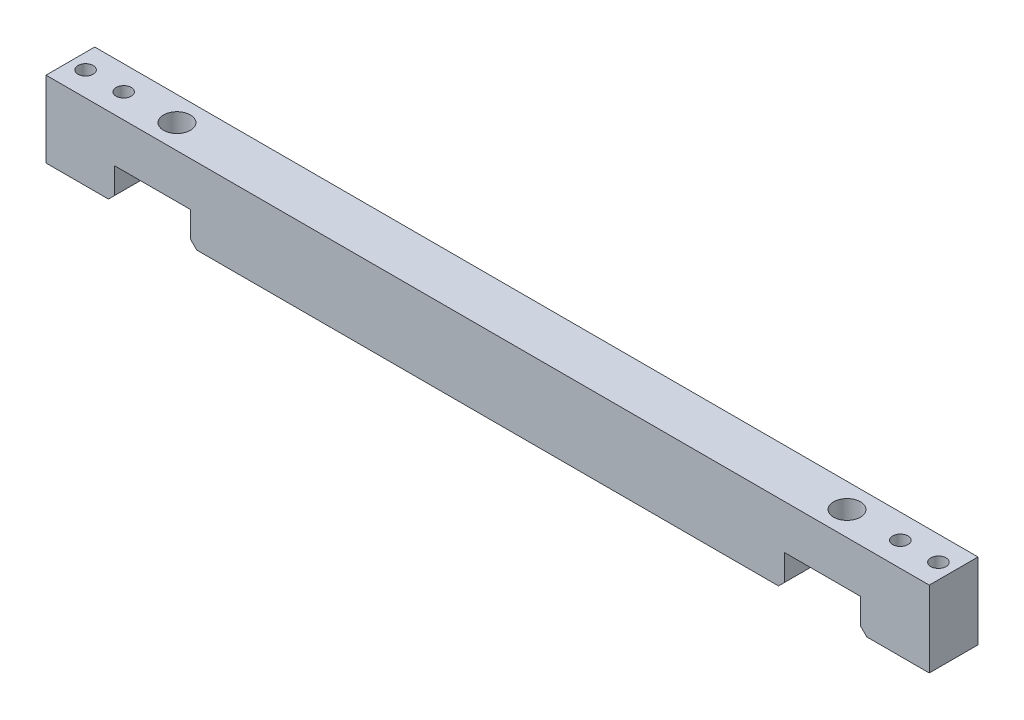
ISO-10303-21;
HEADER;
FILE_DESCRIPTION(('STEP AP214'),'2;1');
FILE_NAME('part.step','',(''),(''),'','','');
FILE_SCHEMA(('AUTOMOTIVE_DESIGN { 1 0 10303 214 1 1 1 1 }'));
ENDSEC;
DATA;
#1=APPLICATION_CONTEXT('core data for automotive mechanical design processes');
#2=APPLICATION_PROTOCOL_DEFINITION('international standard','automotive_design',2000,#1);
#3=PRODUCT_CONTEXT('',#1,'mechanical');
#4=PRODUCT('Part','Part','',(#3));
#5=PRODUCT_RELATED_PRODUCT_CATEGORY('part','',(#4));
#6=PRODUCT_DEFINITION_FORMATION('','',#4);
#7=PRODUCT_DEFINITION_CONTEXT('part definition',#1,'design');
#8=PRODUCT_DEFINITION('design','',#6,#7);
#9=PRODUCT_DEFINITION_SHAPE('','',#8);
#10=(LENGTH_UNIT() NAMED_UNIT(*) SI_UNIT(.MILLI.,.METRE.));
#11=(NAMED_UNIT(*) PLANE_ANGLE_UNIT() SI_UNIT($,.RADIAN.));
#12=(NAMED_UNIT(*) SI_UNIT($,.STERADIAN.) SOLID_ANGLE_UNIT());
#13=UNCERTAINTY_MEASURE_WITH_UNIT(LENGTH_MEASURE(1.E-05),#10,'distance_accuracy_value','');
#14=(GEOMETRIC_REPRESENTATION_CONTEXT(3) GLOBAL_UNCERTAINTY_ASSIGNED_CONTEXT((#13)) GLOBAL_UNIT_ASSIGNED_CONTEXT((#10,
#11,#12)) REPRESENTATION_CONTEXT('',''));
#15=CARTESIAN_POINT('',(0.,0.,0.));
#16=DIRECTION('',(0.,0.,1.));
#17=DIRECTION('',(1.,0.,0.));
#18=AXIS2_PLACEMENT_3D('',#15,#16,#17);
#19=CARTESIAN_POINT('',(0.,-12.5,0.));
#20=DIRECTION('',(0.,1.,0.));
#21=DIRECTION('',(0.,0.,1.));
#22=AXIS2_PLACEMENT_3D('',#19,#20,#21);
#23=PLANE('',#22);
#24=DIRECTION('',(1.,0.,0.));
#25=VECTOR('',#24,1.);
#26=CARTESIAN_POINT('',(-145.,-12.5,8.));
#27=LINE('',#26,#25);
#28=CARTESIAN_POINT('',(-95.5,-12.5,8.));
#29=VERTEX_POINT('',#28);
#30=CARTESIAN_POINT('',(95.5,-12.5,8.));
#31=VERTEX_POINT('',#30);
#32=EDGE_CURVE('E284',#29,#31,#27,.T.);
#33=ORIENTED_EDGE('',*,*,#32,.F.);
#34=DIRECTION('',(0.,0.,-1.));
#35=VECTOR('',#34,1.);
#36=CARTESIAN_POINT('',(-95.5,-12.5,-8.));
#37=LINE('',#36,#35);
#38=CARTESIAN_POINT('',(-95.5,-12.5,-8.));
#39=VERTEX_POINT('',#38);
#40=EDGE_CURVE('E11',#29,#39,#37,.T.);
#41=ORIENTED_EDGE('',*,*,#40,.T.);
#42=DIRECTION('',(-1.,0.,0.));
#43=VECTOR('',#42,1.);
#44=CARTESIAN_POINT('',(-145.,-12.5,-8.));
#45=LINE('',#44,#43);
#46=CARTESIAN_POINT('',(95.5,-12.5,-8.));
#47=VERTEX_POINT('',#46);
#48=EDGE_CURVE('E279',#47,#39,#45,.T.);
#49=ORIENTED_EDGE('',*,*,#48,.F.);
#50=DIRECTION('',(0.,0.,1.));
#51=VECTOR('',#50,1.);
#52=CARTESIAN_POINT('',(95.5,-12.5,0.));
#53=LINE('',#52,#51);
#54=EDGE_CURVE('E311',#47,#31,#53,.T.);
#55=ORIENTED_EDGE('',*,*,#54,.T.);
#56=EDGE_LOOP('',(#33,#41,#49,#55));
#57=FACE_BOUND('',#56,.T.);
#58=ADVANCED_FACE('F49',(#57),#23,.F.);
#59=CARTESIAN_POINT('',(-124.5,-12.5,-8.));
#60=VERTEX_POINT('',#59);
#61=CARTESIAN_POINT('',(-145.,-12.5,-8.));
#62=VERTEX_POINT('',#61);
#63=EDGE_CURVE('E274',#60,#62,#45,.T.);
#64=ORIENTED_EDGE('',*,*,#63,.F.);
#65=DIRECTION('',(0.,0.,1.));
#66=VECTOR('',#65,1.);
#67=CARTESIAN_POINT('',(-124.5,-12.5,8.));
#68=LINE('',#67,#66);
#69=CARTESIAN_POINT('',(-124.5,-12.5,8.));
#70=VERTEX_POINT('',#69);
#71=EDGE_CURVE('E328',#60,#70,#68,.T.);
#72=ORIENTED_EDGE('',*,*,#71,.T.);
#73=CARTESIAN_POINT('',(-145.,-12.5,8.));
#74=VERTEX_POINT('',#73);
#75=EDGE_CURVE('E264',#74,#70,#27,.T.);
#76=ORIENTED_EDGE('',*,*,#75,.F.);
#77=DIRECTION('',(0.,0.,1.));
#78=VECTOR('',#77,1.);
#79=CARTESIAN_POINT('',(-145.,-12.5,-8.));
#80=LINE('',#79,#78);
#81=EDGE_CURVE('E278',#62,#74,#80,.T.);
#82=ORIENTED_EDGE('',*,*,#81,.F.);
#83=EDGE_LOOP('',(#64,#72,#76,#82));
#84=FACE_BOUND('',#83,.T.);
#85=ADVANCED_FACE('F354',(#84),#23,.F.);
#86=CARTESIAN_POINT('',(-145.,12.5,-8.));
#87=DIRECTION('',(0.,0.,1.));
#88=DIRECTION('',(1.,0.,0.));
#89=AXIS2_PLACEMENT_3D('',#86,#87,#88);
#90=PLANE('',#89);
#91=DIRECTION('',(0.,1.,0.));
#92=VECTOR('',#91,1.);
#93=CARTESIAN_POINT('',(-122.5,-2.,-8.));
#94=LINE('',#93,#92);
#95=CARTESIAN_POINT('',(-122.5,-10.5,-8.));
#96=VERTEX_POINT('',#95);
#97=CARTESIAN_POINT('',(-122.5,-2.,-8.));
#98=VERTEX_POINT('',#97);
#99=EDGE_CURVE('E226',#96,#98,#94,.T.);
#100=ORIENTED_EDGE('',*,*,#99,.F.);
#101=DIRECTION('',(-0.707106781186543,-0.707106781186552,0.));
#102=VECTOR('',#101,1.);
#103=CARTESIAN_POINT('',(-122.5,-10.5,-8.));
#104=LINE('',#103,#102);
#105=EDGE_CURVE('E326',#96,#60,#104,.T.);
#106=ORIENTED_EDGE('',*,*,#105,.T.);
#107=ORIENTED_EDGE('',*,*,#63,.T.);
#108=DIRECTION('',(0.,-1.,0.));
#109=VECTOR('',#108,1.);
#110=CARTESIAN_POINT('',(-145.,12.5,-8.));
#111=LINE('',#110,#109);
#112=CARTESIAN_POINT('',(-145.,12.5,-8.));
#113=VERTEX_POINT('',#112);
#114=EDGE_CURVE('E290',#113,#62,#111,.T.);
#115=ORIENTED_EDGE('',*,*,#114,.F.);
#116=DIRECTION('',(-1.,0.,0.));
#117=VECTOR('',#116,1.);
#118=CARTESIAN_POINT('',(-145.,12.5,-8.));
#119=LINE('',#118,#117);
#120=CARTESIAN_POINT('',(145.,12.5,-8.));
#121=VERTEX_POINT('',#120);
#122=EDGE_CURVE('E263',#121,#113,#119,.T.);
#123=ORIENTED_EDGE('',*,*,#122,.F.);
#124=DIRECTION('',(0.,-1.,0.));
#125=VECTOR('',#124,1.);
#126=CARTESIAN_POINT('',(145.,12.5,-8.));
#127=LINE('',#126,#125);
#128=CARTESIAN_POINT('',(145.,-12.5,-8.));
#129=VERTEX_POINT('',#128);
#130=EDGE_CURVE('E293',#121,#129,#127,.T.);
#131=ORIENTED_EDGE('',*,*,#130,.T.);
#132=CARTESIAN_POINT('',(124.5,-12.5,-8.));
#133=VERTEX_POINT('',#132);
#134=EDGE_CURVE('E275',#129,#133,#45,.T.);
#135=ORIENTED_EDGE('',*,*,#134,.T.);
#136=DIRECTION('',(0.707106781186543,-0.707106781186552,0.));
#137=VECTOR('',#136,1.);
#138=CARTESIAN_POINT('',(124.5,-12.5,-8.));
#139=LINE('',#138,#137);
#140=CARTESIAN_POINT('',(122.5,-10.5,-8.));
#141=VERTEX_POINT('',#140);
#142=EDGE_CURVE('E303',#133,#141,#139,.F.);
#143=ORIENTED_EDGE('',*,*,#142,.T.);
#144=DIRECTION('',(0.,1.,0.));
#145=VECTOR('',#144,1.);
#146=CARTESIAN_POINT('',(122.5,-2.,-8.));
#147=LINE('',#146,#145);
#148=CARTESIAN_POINT('',(122.5,-2.,-8.));
#149=VERTEX_POINT('',#148);
#150=EDGE_CURVE('E241',#141,#149,#147,.T.);
#151=ORIENTED_EDGE('',*,*,#150,.T.);
#152=DIRECTION('',(-1.,0.,0.));
#153=VECTOR('',#152,1.);
#154=CARTESIAN_POINT('',(97.5,-2.,-8.));
#155=LINE('',#154,#153);
#156=CARTESIAN_POINT('',(97.5,-2.,-8.));
#157=VERTEX_POINT('',#156);
#158=EDGE_CURVE('E244',#149,#157,#155,.T.);
#159=ORIENTED_EDGE('',*,*,#158,.T.);
#160=DIRECTION('',(0.,-1.,0.));
#161=VECTOR('',#160,1.);
#162=CARTESIAN_POINT('',(97.5,-2.,-8.));
#163=LINE('',#162,#161);
#164=CARTESIAN_POINT('',(97.5,-10.4999999999999,-8.));
#165=VERTEX_POINT('',#164);
#166=EDGE_CURVE('E238',#157,#165,#163,.T.);
#167=ORIENTED_EDGE('',*,*,#166,.T.);
#168=DIRECTION('',(0.707106781186538,0.707106781186557,0.));
#169=VECTOR('',#168,1.);
#170=CARTESIAN_POINT('',(95.5,-12.5,-8.));
#171=LINE('',#170,#169);
#172=EDGE_CURVE('E301',#165,#47,#171,.F.);
#173=ORIENTED_EDGE('',*,*,#172,.T.);
#174=ORIENTED_EDGE('',*,*,#48,.T.);
#175=DIRECTION('',(-0.707106781186538,0.707106781186557,0.));
#176=VECTOR('',#175,1.);
#177=CARTESIAN_POINT('',(-97.5,-10.4999999999999,-8.));
#178=LINE('',#177,#176);
#179=CARTESIAN_POINT('',(-97.5,-10.4999999999999,-8.));
#180=VERTEX_POINT('',#179);
#181=EDGE_CURVE('E324',#39,#180,#178,.T.);
#182=ORIENTED_EDGE('',*,*,#181,.T.);
#183=DIRECTION('',(0.,-1.,0.));
#184=VECTOR('',#183,1.);
#185=CARTESIAN_POINT('',(-97.5,-2.,-8.));
#186=LINE('',#185,#184);
#187=CARTESIAN_POINT('',(-97.5,-2.,-8.));
#188=VERTEX_POINT('',#187);
#189=EDGE_CURVE('E220',#188,#180,#186,.T.);
#190=ORIENTED_EDGE('',*,*,#189,.F.);
#191=DIRECTION('',(1.,0.,0.));
#192=VECTOR('',#191,1.);
#193=CARTESIAN_POINT('',(-97.5,-2.,-8.));
#194=LINE('',#193,#192);
#195=EDGE_CURVE('E223',#98,#188,#194,.T.);
#196=ORIENTED_EDGE('',*,*,#195,.F.);
#197=EDGE_LOOP('',(#100,#106,#107,#115,#123,#131,#135,#143,#151,#159,#167,#173,#174,#182,#190,#196));
#198=FACE_BOUND('',#197,.T.);
#199=ADVANCED_FACE('F361',(#198),#90,.F.);
#200=CARTESIAN_POINT('',(-145.,12.5,8.));
#201=DIRECTION('',(0.,0.,-1.));
#202=DIRECTION('',(-1.,0.,0.));
#203=AXIS2_PLACEMENT_3D('',#200,#201,#202);
#204=PLANE('',#203);
#205=ORIENTED_EDGE('',*,*,#75,.T.);
#206=DIRECTION('',(0.707106781186543,0.707106781186552,0.));
#207=VECTOR('',#206,1.);
#208=CARTESIAN_POINT('',(-122.5,-10.5,8.));
#209=LINE('',#208,#207);
#210=CARTESIAN_POINT('',(-122.5,-10.5,8.));
#211=VERTEX_POINT('',#210);
#212=EDGE_CURVE('E331',#70,#211,#209,.T.);
#213=ORIENTED_EDGE('',*,*,#212,.T.);
#214=DIRECTION('',(0.,-1.,0.));
#215=VECTOR('',#214,1.);
#216=CARTESIAN_POINT('',(-122.5,12.5,8.));
#217=LINE('',#216,#215);
#218=CARTESIAN_POINT('',(-122.5,-2.,8.));
#219=VERTEX_POINT('',#218);
#220=EDGE_CURVE('E316',#219,#211,#217,.T.);
#221=ORIENTED_EDGE('',*,*,#220,.F.);
#222=DIRECTION('',(1.,0.,0.));
#223=VECTOR('',#222,1.);
#224=CARTESIAN_POINT('',(-97.5,-2.,8.));
#225=LINE('',#224,#223);
#226=CARTESIAN_POINT('',(-97.5,-2.,8.));
#227=VERTEX_POINT('',#226);
#228=EDGE_CURVE('E224',#219,#227,#225,.T.);
#229=ORIENTED_EDGE('',*,*,#228,.T.);
#230=DIRECTION('',(0.,-1.,0.));
#231=VECTOR('',#230,1.);
#232=CARTESIAN_POINT('',(-97.5,-2.,8.));
#233=LINE('',#232,#231);
#234=CARTESIAN_POINT('',(-97.5,-10.4999999999999,8.));
#235=VERTEX_POINT('',#234);
#236=EDGE_CURVE('E229',#227,#235,#233,.T.);
#237=ORIENTED_EDGE('',*,*,#236,.T.);
#238=DIRECTION('',(0.707106781186538,-0.707106781186557,0.));
#239=VECTOR('',#238,1.);
#240=CARTESIAN_POINT('',(-97.5,-10.4999999999999,8.));
#241=LINE('',#240,#239);
#242=EDGE_CURVE('E67',#235,#29,#241,.T.);
#243=ORIENTED_EDGE('',*,*,#242,.T.);
#244=ORIENTED_EDGE('',*,*,#32,.T.);
#245=DIRECTION('',(-0.707106781186538,-0.707106781186557,0.));
#246=VECTOR('',#245,1.);
#247=CARTESIAN_POINT('',(95.5,-12.5,8.));
#248=LINE('',#247,#246);
#249=CARTESIAN_POINT('',(97.5,-10.4999999999999,8.));
#250=VERTEX_POINT('',#249);
#251=EDGE_CURVE('E307',#31,#250,#248,.F.);
#252=ORIENTED_EDGE('',*,*,#251,.T.);
#253=DIRECTION('',(0.,-1.,0.));
#254=VECTOR('',#253,1.);
#255=CARTESIAN_POINT('',(97.5,-2.,8.));
#256=LINE('',#255,#254);
#257=CARTESIAN_POINT('',(97.5,-2.,8.));
#258=VERTEX_POINT('',#257);
#259=EDGE_CURVE('E248',#258,#250,#256,.T.);
#260=ORIENTED_EDGE('',*,*,#259,.F.);
#261=DIRECTION('',(-1.,0.,0.));
#262=VECTOR('',#261,1.);
#263=CARTESIAN_POINT('',(97.5,-2.,8.));
#264=LINE('',#263,#262);
#265=CARTESIAN_POINT('',(122.5,-2.,8.));
#266=VERTEX_POINT('',#265);
#267=EDGE_CURVE('E242',#266,#258,#264,.T.);
#268=ORIENTED_EDGE('',*,*,#267,.F.);
#269=DIRECTION('',(0.,1.,0.));
#270=VECTOR('',#269,1.);
#271=CARTESIAN_POINT('',(122.5,-2.,8.));
#272=LINE('',#271,#270);
#273=CARTESIAN_POINT('',(122.5,-10.5,8.));
#274=VERTEX_POINT('',#273);
#275=EDGE_CURVE('E251',#274,#266,#272,.T.);
#276=ORIENTED_EDGE('',*,*,#275,.F.);
#277=DIRECTION('',(-0.707106781186543,0.707106781186552,0.));
#278=VECTOR('',#277,1.);
#279=CARTESIAN_POINT('',(124.5,-12.5,8.));
#280=LINE('',#279,#278);
#281=CARTESIAN_POINT('',(124.5,-12.5,8.));
#282=VERTEX_POINT('',#281);
#283=EDGE_CURVE('E309',#274,#282,#280,.F.);
#284=ORIENTED_EDGE('',*,*,#283,.T.);
#285=CARTESIAN_POINT('',(145.,-12.5,8.));
#286=VERTEX_POINT('',#285);
#287=EDGE_CURVE('E281',#282,#286,#27,.T.);
#288=ORIENTED_EDGE('',*,*,#287,.T.);
#289=DIRECTION('',(0.,-1.,0.));
#290=VECTOR('',#289,1.);
#291=CARTESIAN_POINT('',(145.,12.5,8.));
#292=LINE('',#291,#290);
#293=CARTESIAN_POINT('',(145.,12.5,8.));
#294=VERTEX_POINT('',#293);
#295=EDGE_CURVE('E270',#294,#286,#292,.T.);
#296=ORIENTED_EDGE('',*,*,#295,.F.);
#297=DIRECTION('',(1.,0.,0.));
#298=VECTOR('',#297,1.);
#299=CARTESIAN_POINT('',(-145.,12.5,8.));
#300=LINE('',#299,#298);
#301=CARTESIAN_POINT('',(-145.,12.5,8.));
#302=VERTEX_POINT('',#301);
#303=EDGE_CURVE('E268',#302,#294,#300,.T.);
#304=ORIENTED_EDGE('',*,*,#303,.F.);
#305=DIRECTION('',(0.,-1.,0.));
#306=VECTOR('',#305,1.);
#307=CARTESIAN_POINT('',(-145.,12.5,8.));
#308=LINE('',#307,#306);
#309=EDGE_CURVE('E287',#302,#74,#308,.T.);
#310=ORIENTED_EDGE('',*,*,#309,.T.);
#311=EDGE_LOOP('',(#205,#213,#221,#229,#237,#243,#244,#252,#260,#268,#276,#284,#288,#296,#304,#310));
#312=FACE_BOUND('',#311,.T.);
#313=ADVANCED_FACE('F416',(#312),#204,.F.);
#314=CARTESIAN_POINT('',(-110.,12.5,0.));
#315=DIRECTION('',(0.,1.,0.));
#316=DIRECTION('',(0.,0.,1.));
#317=AXIS2_PLACEMENT_3D('',#314,#315,#316);
#318=CYLINDRICAL_SURFACE('',#317,2.1);
#319=CARTESIAN_POINT('',(-110.,2.11802057623661,0.));
#320=DIRECTION('',(0.,1.,0.));
#321=DIRECTION('',(0.,0.,1.));
#322=AXIS2_PLACEMENT_3D('',#319,#320,#321);
#323=CIRCLE('',#322,2.1);
#324=CARTESIAN_POINT('',(-110.,2.11802057623661,2.1));
#325=VERTEX_POINT('',#324);
#326=EDGE_CURVE('E54',#325,#325,#323,.T.);
#327=ORIENTED_EDGE('',*,*,#326,.T.);
#328=EDGE_LOOP('',(#327));
#329=FACE_BOUND('',#328,.T.);
#330=CARTESIAN_POINT('',(-110.,-2.,0.));
#331=DIRECTION('',(0.,-1.,0.));
#332=DIRECTION('',(1.,0.,0.));
#333=AXIS2_PLACEMENT_3D('',#330,#331,#332);
#334=CIRCLE('',#333,2.1);
#335=CARTESIAN_POINT('',(-107.9,-2.,0.));
#336=VERTEX_POINT('',#335);
#337=EDGE_CURVE('E235',#336,#336,#334,.F.);
#338=ORIENTED_EDGE('',*,*,#337,.F.);
#339=EDGE_LOOP('',(#338));
#340=FACE_BOUND('',#339,.T.);
#341=ADVANCED_FACE('F448',(#329,#340),#318,.F.);
#342=CARTESIAN_POINT('',(145.,12.5,-8.));
#343=DIRECTION('',(-1.,0.,0.));
#344=DIRECTION('',(0.,0.,1.));
#345=AXIS2_PLACEMENT_3D('',#342,#343,#344);
#346=PLANE('',#345);
#347=DIRECTION('',(0.,0.,-1.));
#348=VECTOR('',#347,1.);
#349=CARTESIAN_POINT('',(145.,-12.5,-8.));
#350=LINE('',#349,#348);
#351=EDGE_CURVE('E271',#286,#129,#350,.T.);
#352=ORIENTED_EDGE('',*,*,#351,.T.);
#353=ORIENTED_EDGE('',*,*,#130,.F.);
#354=DIRECTION('',(0.,0.,-1.));
#355=VECTOR('',#354,1.);
#356=CARTESIAN_POINT('',(145.,12.5,-8.));
#357=LINE('',#356,#355);
#358=EDGE_CURVE('E260',#294,#121,#357,.T.);
#359=ORIENTED_EDGE('',*,*,#358,.F.);
#360=ORIENTED_EDGE('',*,*,#295,.T.);
#361=EDGE_LOOP('',(#352,#353,#359,#360));
#362=FACE_BOUND('',#361,.T.);
#363=ADVANCED_FACE('F450',(#362),#346,.F.);
#364=CARTESIAN_POINT('',(-145.,12.5,-8.));
#365=DIRECTION('',(1.,0.,0.));
#366=DIRECTION('',(0.,0.,-1.));
#367=AXIS2_PLACEMENT_3D('',#364,#365,#366);
#368=PLANE('',#367);
#369=ORIENTED_EDGE('',*,*,#81,.T.);
#370=ORIENTED_EDGE('',*,*,#309,.F.);
#371=DIRECTION('',(0.,0.,1.));
#372=VECTOR('',#371,1.);
#373=CARTESIAN_POINT('',(-145.,12.5,-8.));
#374=LINE('',#373,#372);
#375=EDGE_CURVE('E266',#113,#302,#374,.T.);
#376=ORIENTED_EDGE('',*,*,#375,.F.);
#377=ORIENTED_EDGE('',*,*,#114,.T.);
#378=EDGE_LOOP('',(#369,#370,#376,#377));
#379=FACE_BOUND('',#378,.T.);
#380=ADVANCED_FACE('F374',(#379),#368,.F.);
#381=CARTESIAN_POINT('',(0.,12.5,0.));
#382=DIRECTION('',(0.,1.,0.));
#383=DIRECTION('',(0.,0.,1.));
#384=AXIS2_PLACEMENT_3D('',#381,#382,#383);
#385=PLANE('',#384);
#386=CARTESIAN_POINT('',(-140.,12.5,0.));
#387=DIRECTION('',(0.,1.,0.));
#388=DIRECTION('',(0.,0.,1.));
#389=AXIS2_PLACEMENT_3D('',#386,#387,#388);
#390=CIRCLE('',#389,2.5);
#391=CARTESIAN_POINT('',(-140.,12.5,2.5));
#392=VERTEX_POINT('',#391);
#393=EDGE_CURVE('E185',#392,#392,#390,.T.);
#394=ORIENTED_EDGE('',*,*,#393,.F.);
#395=EDGE_LOOP('',(#394));
#396=FACE_BOUND('',#395,.T.);
#397=CARTESIAN_POINT('',(-127.5,12.5,0.));
#398=DIRECTION('',(0.,1.,0.));
#399=DIRECTION('',(0.,0.,1.));
#400=AXIS2_PLACEMENT_3D('',#397,#398,#399);
#401=CIRCLE('',#400,2.5);
#402=CARTESIAN_POINT('',(-127.5,12.5,2.5));
#403=VERTEX_POINT('',#402);
#404=EDGE_CURVE('E184',#403,#403,#401,.T.);
#405=ORIENTED_EDGE('',*,*,#404,.F.);
#406=EDGE_LOOP('',(#405));
#407=FACE_BOUND('',#406,.T.);
#408=CARTESIAN_POINT('',(127.5,12.5,0.));
#409=DIRECTION('',(0.,1.,0.));
#410=DIRECTION('',(0.,0.,1.));
#411=AXIS2_PLACEMENT_3D('',#408,#409,#410);
#412=CIRCLE('',#411,2.5);
#413=CARTESIAN_POINT('',(127.5,12.5,2.5));
#414=VERTEX_POINT('',#413);
#415=EDGE_CURVE('E195',#414,#414,#412,.T.);
#416=ORIENTED_EDGE('',*,*,#415,.F.);
#417=EDGE_LOOP('',(#416));
#418=FACE_BOUND('',#417,.T.);
#419=CARTESIAN_POINT('',(140.,12.5,0.));
#420=DIRECTION('',(0.,1.,0.));
#421=DIRECTION('',(0.,0.,1.));
#422=AXIS2_PLACEMENT_3D('',#419,#420,#421);
#423=CIRCLE('',#422,2.5);
#424=CARTESIAN_POINT('',(140.,12.5,2.5));
#425=VERTEX_POINT('',#424);
#426=EDGE_CURVE('E201',#425,#425,#423,.T.);
#427=ORIENTED_EDGE('',*,*,#426,.F.);
#428=EDGE_LOOP('',(#427));
#429=FACE_BOUND('',#428,.T.);
#430=CARTESIAN_POINT('',(-110.,12.5,0.));
#431=DIRECTION('',(0.,1.,0.));
#432=DIRECTION('',(0.,0.,1.));
#433=AXIS2_PLACEMENT_3D('',#430,#431,#432);
#434=CIRCLE('',#433,4.39999999999999);
#435=CARTESIAN_POINT('',(-110.,12.5,4.39999999999999));
#436=VERTEX_POINT('',#435);
#437=EDGE_CURVE('E207',#436,#436,#434,.T.);
#438=ORIENTED_EDGE('',*,*,#437,.F.);
#439=EDGE_LOOP('',(#438));
#440=FACE_BOUND('',#439,.T.);
#441=CARTESIAN_POINT('',(110.,12.5,0.));
#442=DIRECTION('',(0.,1.,0.));
#443=DIRECTION('',(0.,0.,1.));
#444=AXIS2_PLACEMENT_3D('',#441,#442,#443);
#445=CIRCLE('',#444,4.39999999999999);
#446=CARTESIAN_POINT('',(110.,12.5,4.39999999999999));
#447=VERTEX_POINT('',#446);
#448=EDGE_CURVE('E213',#447,#447,#445,.T.);
#449=ORIENTED_EDGE('',*,*,#448,.F.);
#450=EDGE_LOOP('',(#449));
#451=FACE_BOUND('',#450,.T.);
#452=ORIENTED_EDGE('',*,*,#358,.T.);
#453=ORIENTED_EDGE('',*,*,#122,.T.);
#454=ORIENTED_EDGE('',*,*,#375,.T.);
#455=ORIENTED_EDGE('',*,*,#303,.T.);
#456=EDGE_LOOP('',(#452,#453,#454,#455));
#457=FACE_BOUND('',#456,.T.);
#458=ADVANCED_FACE('F366',(#396,#407,#418,#429,#440,#451,#457),#385,.T.);
#459=ORIENTED_EDGE('',*,*,#287,.F.);
#460=DIRECTION('',(0.,0.,-1.));
#461=VECTOR('',#460,1.);
#462=CARTESIAN_POINT('',(124.5,-12.5,0.));
#463=LINE('',#462,#461);
#464=EDGE_CURVE('E296',#282,#133,#463,.T.);
#465=ORIENTED_EDGE('',*,*,#464,.T.);
#466=ORIENTED_EDGE('',*,*,#134,.F.);
#467=ORIENTED_EDGE('',*,*,#351,.F.);
#468=EDGE_LOOP('',(#459,#465,#466,#467));
#469=FACE_BOUND('',#468,.T.);
#470=ADVANCED_FACE('F357',(#469),#23,.F.);
#471=CARTESIAN_POINT('',(110.,12.5,0.));
#472=DIRECTION('',(0.,1.,0.));
#473=DIRECTION('',(0.,0.,1.));
#474=AXIS2_PLACEMENT_3D('',#471,#472,#473);
#475=CYLINDRICAL_SURFACE('',#474,2.1);
#476=CARTESIAN_POINT('',(110.,2.11802057623661,0.));
#477=DIRECTION('',(0.,1.,0.));
#478=DIRECTION('',(0.,0.,1.));
#479=AXIS2_PLACEMENT_3D('',#476,#477,#478);
#480=CIRCLE('',#479,2.1);
#481=CARTESIAN_POINT('',(110.,2.11802057623661,2.1));
#482=VERTEX_POINT('',#481);
#483=EDGE_CURVE('E219',#482,#482,#480,.T.);
#484=ORIENTED_EDGE('',*,*,#483,.T.);
#485=EDGE_LOOP('',(#484));
#486=FACE_BOUND('',#485,.T.);
#487=CARTESIAN_POINT('',(110.,-2.,0.));
#488=DIRECTION('',(0.,1.,0.));
#489=DIRECTION('',(-1.,0.,0.));
#490=AXIS2_PLACEMENT_3D('',#487,#488,#489);
#491=CIRCLE('',#490,2.1);
#492=CARTESIAN_POINT('',(107.9,-2.,0.));
#493=VERTEX_POINT('',#492);
#494=EDGE_CURVE('E257',#493,#493,#491,.F.);
#495=ORIENTED_EDGE('',*,*,#494,.T.);
#496=EDGE_LOOP('',(#495));
#497=FACE_BOUND('',#496,.T.);
#498=ADVANCED_FACE('F336',(#486,#497),#475,.F.);
#499=CARTESIAN_POINT('',(97.5,-2.,-8.));
#500=DIRECTION('',(-1.,0.,0.));
#501=DIRECTION('',(0.,0.,1.));
#502=AXIS2_PLACEMENT_3D('',#499,#500,#501);
#503=PLANE('',#502);
#504=ORIENTED_EDGE('',*,*,#259,.T.);
#505=DIRECTION('',(0.,0.,-1.));
#506=VECTOR('',#505,1.);
#507=CARTESIAN_POINT('',(97.5,-10.4999999999999,-8.));
#508=LINE('',#507,#506);
#509=EDGE_CURVE('E314',#250,#165,#508,.T.);
#510=ORIENTED_EDGE('',*,*,#509,.T.);
#511=ORIENTED_EDGE('',*,*,#166,.F.);
#512=DIRECTION('',(0.,0.,1.));
#513=VECTOR('',#512,1.);
#514=CARTESIAN_POINT('',(97.5,-2.,-8.));
#515=LINE('',#514,#513);
#516=EDGE_CURVE('E255',#157,#258,#515,.T.);
#517=ORIENTED_EDGE('',*,*,#516,.T.);
#518=EDGE_LOOP('',(#504,#510,#511,#517));
#519=FACE_BOUND('',#518,.T.);
#520=ADVANCED_FACE('F372',(#519),#503,.F.);
#521=CARTESIAN_POINT('',(122.5,-2.,-8.));
#522=DIRECTION('',(1.,0.,0.));
#523=DIRECTION('',(0.,0.,-1.));
#524=AXIS2_PLACEMENT_3D('',#521,#522,#523);
#525=PLANE('',#524);
#526=ORIENTED_EDGE('',*,*,#150,.F.);
#527=DIRECTION('',(0.,0.,1.));
#528=VECTOR('',#527,1.);
#529=CARTESIAN_POINT('',(122.5,-10.5,-8.));
#530=LINE('',#529,#528);
#531=EDGE_CURVE('E305',#141,#274,#530,.T.);
#532=ORIENTED_EDGE('',*,*,#531,.T.);
#533=ORIENTED_EDGE('',*,*,#275,.T.);
#534=DIRECTION('',(0.,0.,1.));
#535=VECTOR('',#534,1.);
#536=CARTESIAN_POINT('',(122.5,-2.,-8.));
#537=LINE('',#536,#535);
#538=EDGE_CURVE('E247',#149,#266,#537,.T.);
#539=ORIENTED_EDGE('',*,*,#538,.F.);
#540=EDGE_LOOP('',(#526,#532,#533,#539));
#541=FACE_BOUND('',#540,.T.);
#542=ADVANCED_FACE('F389',(#541),#525,.F.);
#543=CARTESIAN_POINT('',(97.5,-2.,-8.));
#544=DIRECTION('',(0.,1.,0.));
#545=DIRECTION('',(-1.,0.,0.));
#546=AXIS2_PLACEMENT_3D('',#543,#544,#545);
#547=PLANE('',#546);
#548=ORIENTED_EDGE('',*,*,#267,.T.);
#549=ORIENTED_EDGE('',*,*,#516,.F.);
#550=ORIENTED_EDGE('',*,*,#158,.F.);
#551=ORIENTED_EDGE('',*,*,#538,.T.);
#552=EDGE_LOOP('',(#548,#549,#550,#551));
#553=FACE_BOUND('',#552,.T.);
#554=ORIENTED_EDGE('',*,*,#494,.F.);
#555=EDGE_LOOP('',(#554));
#556=FACE_BOUND('',#555,.T.);
#557=ADVANCED_FACE('F394',(#553,#556),#547,.F.);
#558=CARTESIAN_POINT('',(124.5,-12.5,0.));
#559=DIRECTION('',(0.707106781186552,0.707106781186543,0.));
#560=DIRECTION('',(0.,0.,-1.));
#561=AXIS2_PLACEMENT_3D('',#558,#559,#560);
#562=PLANE('',#561);
#563=ORIENTED_EDGE('',*,*,#283,.F.);
#564=ORIENTED_EDGE('',*,*,#531,.F.);
#565=ORIENTED_EDGE('',*,*,#142,.F.);
#566=ORIENTED_EDGE('',*,*,#464,.F.);
#567=EDGE_LOOP('',(#563,#564,#565,#566));
#568=FACE_BOUND('',#567,.T.);
#569=ADVANCED_FACE('F382',(#568),#562,.F.);
#570=CARTESIAN_POINT('',(95.5,-12.5,0.));
#571=DIRECTION('',(-0.707106781186557,0.707106781186538,0.));
#572=DIRECTION('',(0.,0.,1.));
#573=AXIS2_PLACEMENT_3D('',#570,#571,#572);
#574=PLANE('',#573);
#575=ORIENTED_EDGE('',*,*,#172,.F.);
#576=ORIENTED_EDGE('',*,*,#509,.F.);
#577=ORIENTED_EDGE('',*,*,#251,.F.);
#578=ORIENTED_EDGE('',*,*,#54,.F.);
#579=EDGE_LOOP('',(#575,#576,#577,#578));
#580=FACE_BOUND('',#579,.T.);
#581=ADVANCED_FACE('F404',(#580),#574,.F.);
#582=CARTESIAN_POINT('',(-97.5,-2.,-8.));
#583=DIRECTION('',(-1.,0.,0.));
#584=DIRECTION('',(0.,0.,1.));
#585=AXIS2_PLACEMENT_3D('',#582,#583,#584);
#586=PLANE('',#585);
#587=ORIENTED_EDGE('',*,*,#189,.T.);
#588=DIRECTION('',(0.,0.,1.));
#589=VECTOR('',#588,1.);
#590=CARTESIAN_POINT('',(-97.5,-10.4999999999999,8.));
#591=LINE('',#590,#589);
#592=EDGE_CURVE('E59',#180,#235,#591,.T.);
#593=ORIENTED_EDGE('',*,*,#592,.T.);
#594=ORIENTED_EDGE('',*,*,#236,.F.);
#595=DIRECTION('',(0.,0.,1.));
#596=VECTOR('',#595,1.);
#597=CARTESIAN_POINT('',(-97.5,-2.,-8.));
#598=LINE('',#597,#596);
#599=EDGE_CURVE('E228',#188,#227,#598,.T.);
#600=ORIENTED_EDGE('',*,*,#599,.F.);
#601=EDGE_LOOP('',(#587,#593,#594,#600));
#602=FACE_BOUND('',#601,.T.);
#603=ADVANCED_FACE('F432',(#602),#586,.T.);
#604=CARTESIAN_POINT('',(-122.5,-2.,-8.));
#605=DIRECTION('',(1.,0.,0.));
#606=DIRECTION('',(0.,0.,-1.));
#607=AXIS2_PLACEMENT_3D('',#604,#605,#606);
#608=PLANE('',#607);
#609=ORIENTED_EDGE('',*,*,#220,.T.);
#610=DIRECTION('',(0.,0.,-1.));
#611=VECTOR('',#610,1.);
#612=CARTESIAN_POINT('',(-122.5,-10.5,-8.));
#613=LINE('',#612,#611);
#614=EDGE_CURVE('E321',#211,#96,#613,.T.);
#615=ORIENTED_EDGE('',*,*,#614,.T.);
#616=ORIENTED_EDGE('',*,*,#99,.T.);
#617=DIRECTION('',(0.,0.,1.));
#618=VECTOR('',#617,1.);
#619=CARTESIAN_POINT('',(-122.5,-2.,-8.));
#620=LINE('',#619,#618);
#621=EDGE_CURVE('E233',#98,#219,#620,.T.);
#622=ORIENTED_EDGE('',*,*,#621,.T.);
#623=EDGE_LOOP('',(#609,#615,#616,#622));
#624=FACE_BOUND('',#623,.T.);
#625=ADVANCED_FACE('F422',(#624),#608,.T.);
#626=CARTESIAN_POINT('',(-97.5,-2.,-8.));
#627=DIRECTION('',(0.,-1.,0.));
#628=DIRECTION('',(1.,0.,0.));
#629=AXIS2_PLACEMENT_3D('',#626,#627,#628);
#630=PLANE('',#629);
#631=ORIENTED_EDGE('',*,*,#228,.F.);
#632=ORIENTED_EDGE('',*,*,#621,.F.);
#633=ORIENTED_EDGE('',*,*,#195,.T.);
#634=ORIENTED_EDGE('',*,*,#599,.T.);
#635=EDGE_LOOP('',(#631,#632,#633,#634));
#636=FACE_BOUND('',#635,.T.);
#637=ORIENTED_EDGE('',*,*,#337,.T.);
#638=EDGE_LOOP('',(#637));
#639=FACE_BOUND('',#638,.T.);
#640=ADVANCED_FACE('F429',(#636,#639),#630,.T.);
#641=CARTESIAN_POINT('',(-122.5,-10.5,-8.));
#642=DIRECTION('',(0.707106781186552,-0.707106781186543,0.));
#643=DIRECTION('',(0.,0.,1.));
#644=AXIS2_PLACEMENT_3D('',#641,#642,#643);
#645=PLANE('',#644);
#646=ORIENTED_EDGE('',*,*,#212,.F.);
#647=ORIENTED_EDGE('',*,*,#71,.F.);
#648=ORIENTED_EDGE('',*,*,#105,.F.);
#649=ORIENTED_EDGE('',*,*,#614,.F.);
#650=EDGE_LOOP('',(#646,#647,#648,#649));
#651=FACE_BOUND('',#650,.T.);
#652=ADVANCED_FACE('F351',(#651),#645,.T.);
#653=CARTESIAN_POINT('',(-97.5,-10.4999999999999,-8.));
#654=DIRECTION('',(-0.707106781186557,-0.707106781186538,0.));
#655=DIRECTION('',(0.,0.,-1.));
#656=AXIS2_PLACEMENT_3D('',#653,#654,#655);
#657=PLANE('',#656);
#658=ORIENTED_EDGE('',*,*,#181,.F.);
#659=ORIENTED_EDGE('',*,*,#40,.F.);
#660=ORIENTED_EDGE('',*,*,#242,.F.);
#661=ORIENTED_EDGE('',*,*,#592,.F.);
#662=EDGE_LOOP('',(#658,#659,#660,#661));
#663=FACE_BOUND('',#662,.T.);
#664=ADVANCED_FACE('F52',(#663),#657,.T.);
#665=CARTESIAN_POINT('',(110.,3.5,0.));
#666=DIRECTION('',(0.,1.,0.));
#667=DIRECTION('',(0.,0.,1.));
#668=AXIS2_PLACEMENT_3D('',#665,#666,#667);
#669=CONICAL_SURFACE('',#668,4.4,1.02974425867665);
#670=CARTESIAN_POINT('',(110.,3.5,0.));
#671=DIRECTION('',(0.,1.,0.));
#672=DIRECTION('',(0.,0.,1.));
#673=AXIS2_PLACEMENT_3D('',#670,#671,#672);
#674=CIRCLE('',#673,4.4);
#675=CARTESIAN_POINT('',(110.,3.5,4.4));
#676=VERTEX_POINT('',#675);
#677=EDGE_CURVE('E216',#676,#676,#674,.T.);
#678=ORIENTED_EDGE('',*,*,#677,.T.);
#679=EDGE_LOOP('',(#678));
#680=FACE_BOUND('',#679,.T.);
#681=ORIENTED_EDGE('',*,*,#483,.F.);
#682=EDGE_LOOP('',(#681));
#683=FACE_BOUND('',#682,.T.);
#684=ADVANCED_FACE('F339',(#680,#683),#669,.F.);
#685=CARTESIAN_POINT('',(110.,12.5,0.));
#686=DIRECTION('',(0.,1.,0.));
#687=DIRECTION('',(0.,0.,1.));
#688=AXIS2_PLACEMENT_3D('',#685,#686,#687);
#689=CYLINDRICAL_SURFACE('',#688,4.39999999999999);
#690=ORIENTED_EDGE('',*,*,#677,.F.);
#691=EDGE_LOOP('',(#690));
#692=FACE_BOUND('',#691,.T.);
#693=ORIENTED_EDGE('',*,*,#448,.T.);
#694=EDGE_LOOP('',(#693));
#695=FACE_BOUND('',#694,.T.);
#696=ADVANCED_FACE('F341',(#692,#695),#689,.F.);
#697=CARTESIAN_POINT('',(-110.,3.5,0.));
#698=DIRECTION('',(0.,1.,0.));
#699=DIRECTION('',(0.,0.,1.));
#700=AXIS2_PLACEMENT_3D('',#697,#698,#699);
#701=CONICAL_SURFACE('',#700,4.4,1.02974425867665);
#702=CARTESIAN_POINT('',(-110.,3.5,0.));
#703=DIRECTION('',(0.,1.,0.));
#704=DIRECTION('',(0.,0.,1.));
#705=AXIS2_PLACEMENT_3D('',#702,#703,#704);
#706=CIRCLE('',#705,4.4);
#707=CARTESIAN_POINT('',(-110.,3.5,4.4));
#708=VERTEX_POINT('',#707);
#709=EDGE_CURVE('E210',#708,#708,#706,.T.);
#710=ORIENTED_EDGE('',*,*,#709,.T.);
#711=EDGE_LOOP('',(#710));
#712=FACE_BOUND('',#711,.T.);
#713=ORIENTED_EDGE('',*,*,#326,.F.);
#714=EDGE_LOOP('',(#713));
#715=FACE_BOUND('',#714,.T.);
#716=ADVANCED_FACE('F348',(#712,#715),#701,.F.);
#717=CARTESIAN_POINT('',(-110.,12.5,0.));
#718=DIRECTION('',(0.,1.,0.));
#719=DIRECTION('',(0.,0.,1.));
#720=AXIS2_PLACEMENT_3D('',#717,#718,#719);
#721=CYLINDRICAL_SURFACE('',#720,4.39999999999999);
#722=ORIENTED_EDGE('',*,*,#709,.F.);
#723=EDGE_LOOP('',(#722));
#724=FACE_BOUND('',#723,.T.);
#725=ORIENTED_EDGE('',*,*,#437,.T.);
#726=EDGE_LOOP('',(#725));
#727=FACE_BOUND('',#726,.T.);
#728=ADVANCED_FACE('F596',(#724,#727),#721,.F.);
#729=CARTESIAN_POINT('',(140.,-2.5,0.));
#730=DIRECTION('',(0.,1.,0.));
#731=DIRECTION('',(0.,0.,1.));
#732=AXIS2_PLACEMENT_3D('',#729,#730,#731);
#733=CONICAL_SURFACE('',#732,2.49999999999997,1.02974425867665);
#734=CARTESIAN_POINT('',(140.,-4.0021515475689,0.));
#735=VERTEX_POINT('',#734);
#736=VERTEX_LOOP('',#735);
#737=FACE_BOUND('',#736,.T.);
#738=CARTESIAN_POINT('',(140.,-2.5,0.));
#739=DIRECTION('',(0.,1.,0.));
#740=DIRECTION('',(0.,0.,1.));
#741=AXIS2_PLACEMENT_3D('',#738,#739,#740);
#742=CIRCLE('',#741,2.49999999999997);
#743=CARTESIAN_POINT('',(140.,-2.5,2.49999999999997));
#744=VERTEX_POINT('',#743);
#745=EDGE_CURVE('E204',#744,#744,#742,.T.);
#746=ORIENTED_EDGE('',*,*,#745,.T.);
#747=EDGE_LOOP('',(#746));
#748=FACE_BOUND('',#747,.T.);
#749=ADVANCED_FACE('F504',(#737,#748),#733,.F.);
#750=CARTESIAN_POINT('',(140.,12.5,0.));
#751=DIRECTION('',(0.,1.,0.));
#752=DIRECTION('',(0.,0.,1.));
#753=AXIS2_PLACEMENT_3D('',#750,#751,#752);
#754=CYLINDRICAL_SURFACE('',#753,2.49999999999999);
#755=ORIENTED_EDGE('',*,*,#745,.F.);
#756=EDGE_LOOP('',(#755));
#757=FACE_BOUND('',#756,.T.);
#758=ORIENTED_EDGE('',*,*,#426,.T.);
#759=EDGE_LOOP('',(#758));
#760=FACE_BOUND('',#759,.T.);
#761=ADVANCED_FACE('F498',(#757,#760),#754,.F.);
#762=CARTESIAN_POINT('',(127.5,-2.5,0.));
#763=DIRECTION('',(0.,1.,0.));
#764=DIRECTION('',(0.,0.,1.));
#765=AXIS2_PLACEMENT_3D('',#762,#763,#764);
#766=CONICAL_SURFACE('',#765,2.49999999999997,1.02974425867665);
#767=CARTESIAN_POINT('',(127.5,-4.0021515475689,0.));
#768=VERTEX_POINT('',#767);
#769=VERTEX_LOOP('',#768);
#770=FACE_BOUND('',#769,.T.);
#771=CARTESIAN_POINT('',(127.5,-2.5,0.));
#772=DIRECTION('',(0.,1.,0.));
#773=DIRECTION('',(0.,0.,1.));
#774=AXIS2_PLACEMENT_3D('',#771,#772,#773);
#775=CIRCLE('',#774,2.49999999999997);
#776=CARTESIAN_POINT('',(127.5,-2.5,2.49999999999997));
#777=VERTEX_POINT('',#776);
#778=EDGE_CURVE('E198',#777,#777,#775,.T.);
#779=ORIENTED_EDGE('',*,*,#778,.T.);
#780=EDGE_LOOP('',(#779));
#781=FACE_BOUND('',#780,.T.);
#782=ADVANCED_FACE('F503',(#770,#781),#766,.F.);
#783=CARTESIAN_POINT('',(127.5,12.5,0.));
#784=DIRECTION('',(0.,1.,0.));
#785=DIRECTION('',(0.,0.,1.));
#786=AXIS2_PLACEMENT_3D('',#783,#784,#785);
#787=CYLINDRICAL_SURFACE('',#786,2.49999999999999);
#788=ORIENTED_EDGE('',*,*,#778,.F.);
#789=EDGE_LOOP('',(#788));
#790=FACE_BOUND('',#789,.T.);
#791=ORIENTED_EDGE('',*,*,#415,.T.);
#792=EDGE_LOOP('',(#791));
#793=FACE_BOUND('',#792,.T.);
#794=ADVANCED_FACE('F514',(#790,#793),#787,.F.);
#795=CARTESIAN_POINT('',(-127.5,-2.5,0.));
#796=DIRECTION('',(0.,1.,0.));
#797=DIRECTION('',(0.,0.,1.));
#798=AXIS2_PLACEMENT_3D('',#795,#796,#797);
#799=CONICAL_SURFACE('',#798,2.49999999999997,1.02974425867665);
#800=CARTESIAN_POINT('',(-127.5,-4.0021515475689,0.));
#801=VERTEX_POINT('',#800);
#802=VERTEX_LOOP('',#801);
#803=FACE_BOUND('',#802,.T.);
#804=CARTESIAN_POINT('',(-127.5,-2.5,0.));
#805=DIRECTION('',(0.,1.,0.));
#806=DIRECTION('',(0.,0.,1.));
#807=AXIS2_PLACEMENT_3D('',#804,#805,#806);
#808=CIRCLE('',#807,2.49999999999997);
#809=CARTESIAN_POINT('',(-127.5,-2.5,2.49999999999997));
#810=VERTEX_POINT('',#809);
#811=EDGE_CURVE('E188',#810,#810,#808,.T.);
#812=ORIENTED_EDGE('',*,*,#811,.T.);
#813=EDGE_LOOP('',(#812));
#814=FACE_BOUND('',#813,.T.);
#815=ADVANCED_FACE('F519',(#803,#814),#799,.F.);
#816=CARTESIAN_POINT('',(-127.5,12.5,0.));
#817=DIRECTION('',(0.,1.,0.));
#818=DIRECTION('',(0.,0.,1.));
#819=AXIS2_PLACEMENT_3D('',#816,#817,#818);
#820=CYLINDRICAL_SURFACE('',#819,2.49999999999999);
#821=ORIENTED_EDGE('',*,*,#811,.F.);
#822=EDGE_LOOP('',(#821));
#823=FACE_BOUND('',#822,.T.);
#824=ORIENTED_EDGE('',*,*,#404,.T.);
#825=EDGE_LOOP('',(#824));
#826=FACE_BOUND('',#825,.T.);
#827=ADVANCED_FACE('F178',(#823,#826),#820,.F.);
#828=CARTESIAN_POINT('',(-140.,-2.5,0.));
#829=DIRECTION('',(0.,1.,0.));
#830=DIRECTION('',(0.,0.,1.));
#831=AXIS2_PLACEMENT_3D('',#828,#829,#830);
#832=CONICAL_SURFACE('',#831,2.49999999999997,1.02974425867665);
#833=CARTESIAN_POINT('',(-140.,-4.0021515475689,0.));
#834=VERTEX_POINT('',#833);
#835=VERTEX_LOOP('',#834);
#836=FACE_BOUND('',#835,.T.);
#837=CARTESIAN_POINT('',(-140.,-2.5,0.));
#838=DIRECTION('',(0.,1.,0.));
#839=DIRECTION('',(0.,0.,1.));
#840=AXIS2_PLACEMENT_3D('',#837,#838,#839);
#841=CIRCLE('',#840,2.49999999999997);
#842=CARTESIAN_POINT('',(-140.,-2.5,2.49999999999997));
#843=VERTEX_POINT('',#842);
#844=EDGE_CURVE('E182',#843,#843,#841,.T.);
#845=ORIENTED_EDGE('',*,*,#844,.T.);
#846=EDGE_LOOP('',(#845));
#847=FACE_BOUND('',#846,.T.);
#848=ADVANCED_FACE('F174',(#836,#847),#832,.F.);
#849=CARTESIAN_POINT('',(-140.,12.5,0.));
#850=DIRECTION('',(0.,1.,0.));
#851=DIRECTION('',(0.,0.,1.));
#852=AXIS2_PLACEMENT_3D('',#849,#850,#851);
#853=CYLINDRICAL_SURFACE('',#852,2.49999999999999);
#854=ORIENTED_EDGE('',*,*,#844,.F.);
#855=EDGE_LOOP('',(#854));
#856=FACE_BOUND('',#855,.T.);
#857=ORIENTED_EDGE('',*,*,#393,.T.);
#858=EDGE_LOOP('',(#857));
#859=FACE_BOUND('',#858,.T.);
#860=ADVANCED_FACE('F177',(#856,#859),#853,.F.);
#861=CLOSED_SHELL('',(#58,#85,#199,#313,#341,#363,#380,#458,#470,#498,#520,#542,#557,#569,#581,
#603,#625,#640,#652,#664,#684,#696,#716,#728,#749,#761,#782,#794,#815,#827,#848,#860));
#862=MANIFOLD_SOLID_BREP('B2',#861);
#863=ADVANCED_BREP_SHAPE_REPRESENTATION('',(#18,#862),#14);
#864=SHAPE_DEFINITION_REPRESENTATION(#9,#863);
ENDSEC;
END-ISO-10303-21;
